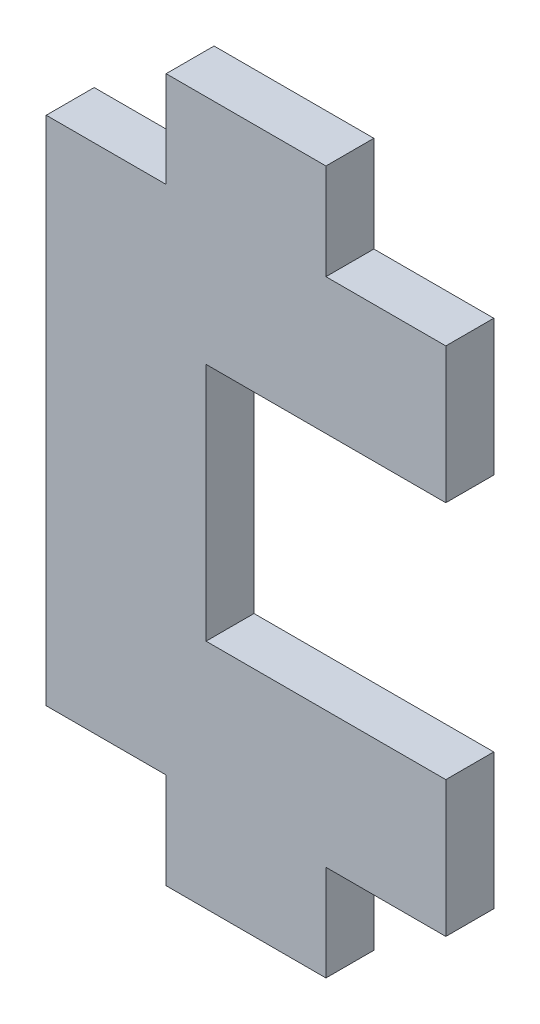
ISO-10303-21;
HEADER;
FILE_DESCRIPTION(('STEP AP214'),'2;1');
FILE_NAME('part.step','',(''),(''),'','','');
FILE_SCHEMA(('AUTOMOTIVE_DESIGN { 1 0 10303 214 1 1 1 1 }'));
ENDSEC;
DATA;
#1=APPLICATION_CONTEXT('core data for automotive mechanical design processes');
#2=APPLICATION_PROTOCOL_DEFINITION('international standard','automotive_design',2000,#1);
#3=PRODUCT_CONTEXT('',#1,'mechanical');
#4=PRODUCT('Part','Part','',(#3));
#5=PRODUCT_RELATED_PRODUCT_CATEGORY('part','',(#4));
#6=PRODUCT_DEFINITION_FORMATION('','',#4);
#7=PRODUCT_DEFINITION_CONTEXT('part definition',#1,'design');
#8=PRODUCT_DEFINITION('design','',#6,#7);
#9=PRODUCT_DEFINITION_SHAPE('','',#8);
#10=(LENGTH_UNIT() NAMED_UNIT(*) SI_UNIT(.MILLI.,.METRE.));
#11=(NAMED_UNIT(*) PLANE_ANGLE_UNIT() SI_UNIT($,.RADIAN.));
#12=(NAMED_UNIT(*) SI_UNIT($,.STERADIAN.) SOLID_ANGLE_UNIT());
#13=UNCERTAINTY_MEASURE_WITH_UNIT(LENGTH_MEASURE(1.E-05),#10,'distance_accuracy_value','');
#14=(GEOMETRIC_REPRESENTATION_CONTEXT(3) GLOBAL_UNCERTAINTY_ASSIGNED_CONTEXT((#13)) GLOBAL_UNIT_ASSIGNED_CONTEXT((#10,
#11,#12)) REPRESENTATION_CONTEXT('',''));
#15=CARTESIAN_POINT('',(0.,0.,0.));
#16=DIRECTION('',(0.,0.,1.));
#17=DIRECTION('',(1.,0.,0.));
#18=AXIS2_PLACEMENT_3D('',#15,#16,#17);
#19=CARTESIAN_POINT('',(0.,-7.5,3.));
#20=DIRECTION('',(0.,1.,0.));
#21=DIRECTION('',(0.,0.,1.));
#22=AXIS2_PLACEMENT_3D('',#19,#20,#21);
#23=PLANE('',#22);
#24=DIRECTION('',(1.,0.,0.));
#25=VECTOR('',#24,1.);
#26=CARTESIAN_POINT('',(0.,-7.5,0.));
#27=LINE('',#26,#25);
#28=CARTESIAN_POINT('',(-2.5,-7.5,0.));
#29=VERTEX_POINT('',#28);
#30=CARTESIAN_POINT('',(12.5,-7.5,0.));
#31=VERTEX_POINT('',#30);
#32=EDGE_CURVE('E231',#29,#31,#27,.T.);
#33=ORIENTED_EDGE('',*,*,#32,.F.);
#34=DIRECTION('',(0.,0.,-1.));
#35=VECTOR('',#34,1.);
#36=CARTESIAN_POINT('',(-2.5,-7.5,3.));
#37=LINE('',#36,#35);
#38=CARTESIAN_POINT('',(-2.5,-7.5,3.));
#39=VERTEX_POINT('',#38);
#40=EDGE_CURVE('E11',#39,#29,#37,.T.);
#41=ORIENTED_EDGE('',*,*,#40,.F.);
#42=DIRECTION('',(1.,0.,0.));
#43=VECTOR('',#42,1.);
#44=CARTESIAN_POINT('',(0.,-7.5,3.));
#45=LINE('',#44,#43);
#46=CARTESIAN_POINT('',(12.5,-7.5,3.));
#47=VERTEX_POINT('',#46);
#48=EDGE_CURVE('E205',#39,#47,#45,.T.);
#49=ORIENTED_EDGE('',*,*,#48,.T.);
#50=DIRECTION('',(0.,0.,-1.));
#51=VECTOR('',#50,1.);
#52=CARTESIAN_POINT('',(12.5,-7.5,3.));
#53=LINE('',#52,#51);
#54=EDGE_CURVE('E112',#47,#31,#53,.T.);
#55=ORIENTED_EDGE('',*,*,#54,.T.);
#56=EDGE_LOOP('',(#33,#41,#49,#55));
#57=FACE_BOUND('',#56,.T.);
#58=ADVANCED_FACE('F37',(#57),#23,.T.);
#59=CARTESIAN_POINT('',(-2.5,0.,3.));
#60=DIRECTION('',(-1.,0.,0.));
#61=DIRECTION('',(0.,0.,1.));
#62=AXIS2_PLACEMENT_3D('',#59,#60,#61);
#63=PLANE('',#62);
#64=DIRECTION('',(0.,1.,0.));
#65=VECTOR('',#64,1.);
#66=CARTESIAN_POINT('',(-2.5,0.,0.));
#67=LINE('',#66,#65);
#68=CARTESIAN_POINT('',(-2.5,7.5,0.));
#69=VERTEX_POINT('',#68);
#70=EDGE_CURVE('E226',#29,#69,#67,.T.);
#71=ORIENTED_EDGE('',*,*,#70,.T.);
#72=DIRECTION('',(0.,0.,-1.));
#73=VECTOR('',#72,1.);
#74=CARTESIAN_POINT('',(-2.5,7.5,3.));
#75=LINE('',#74,#73);
#76=CARTESIAN_POINT('',(-2.5,7.5,3.));
#77=VERTEX_POINT('',#76);
#78=EDGE_CURVE('E45',#77,#69,#75,.T.);
#79=ORIENTED_EDGE('',*,*,#78,.F.);
#80=DIRECTION('',(0.,1.,0.));
#81=VECTOR('',#80,1.);
#82=CARTESIAN_POINT('',(-2.5,0.,3.));
#83=LINE('',#82,#81);
#84=EDGE_CURVE('E203',#39,#77,#83,.T.);
#85=ORIENTED_EDGE('',*,*,#84,.F.);
#86=ORIENTED_EDGE('',*,*,#40,.T.);
#87=EDGE_LOOP('',(#71,#79,#85,#86));
#88=FACE_BOUND('',#87,.T.);
#89=ADVANCED_FACE('F281',(#88),#63,.F.);
#90=CARTESIAN_POINT('',(0.,7.5,3.));
#91=DIRECTION('',(0.,1.,0.));
#92=DIRECTION('',(0.,0.,1.));
#93=AXIS2_PLACEMENT_3D('',#90,#91,#92);
#94=PLANE('',#93);
#95=DIRECTION('',(1.,0.,0.));
#96=VECTOR('',#95,1.);
#97=CARTESIAN_POINT('',(0.,7.5,0.));
#98=LINE('',#97,#96);
#99=CARTESIAN_POINT('',(12.5,7.5,0.));
#100=VERTEX_POINT('',#99);
#101=EDGE_CURVE('E218',#69,#100,#98,.T.);
#102=ORIENTED_EDGE('',*,*,#101,.T.);
#103=DIRECTION('',(0.,0.,-1.));
#104=VECTOR('',#103,1.);
#105=CARTESIAN_POINT('',(12.5,7.5,3.));
#106=LINE('',#105,#104);
#107=CARTESIAN_POINT('',(12.5,7.5,3.));
#108=VERTEX_POINT('',#107);
#109=EDGE_CURVE('E263',#108,#100,#106,.T.);
#110=ORIENTED_EDGE('',*,*,#109,.F.);
#111=DIRECTION('',(1.,0.,0.));
#112=VECTOR('',#111,1.);
#113=CARTESIAN_POINT('',(0.,7.5,3.));
#114=LINE('',#113,#112);
#115=EDGE_CURVE('E201',#77,#108,#114,.T.);
#116=ORIENTED_EDGE('',*,*,#115,.F.);
#117=ORIENTED_EDGE('',*,*,#78,.T.);
#118=EDGE_LOOP('',(#102,#110,#116,#117));
#119=FACE_BOUND('',#118,.T.);
#120=ADVANCED_FACE('F266',(#119),#94,.F.);
#121=CARTESIAN_POINT('',(12.5,0.,3.));
#122=DIRECTION('',(-1.,0.,0.));
#123=DIRECTION('',(0.,0.,1.));
#124=AXIS2_PLACEMENT_3D('',#121,#122,#123);
#125=PLANE('',#124);
#126=DIRECTION('',(0.,1.,0.));
#127=VECTOR('',#126,1.);
#128=CARTESIAN_POINT('',(12.5,0.,0.));
#129=LINE('',#128,#127);
#130=CARTESIAN_POINT('',(12.5,16.,0.));
#131=VERTEX_POINT('',#130);
#132=EDGE_CURVE('E208',#100,#131,#129,.T.);
#133=ORIENTED_EDGE('',*,*,#132,.T.);
#134=DIRECTION('',(0.,0.,-1.));
#135=VECTOR('',#134,1.);
#136=CARTESIAN_POINT('',(12.5,16.,3.));
#137=LINE('',#136,#135);
#138=CARTESIAN_POINT('',(12.5,16.,3.));
#139=VERTEX_POINT('',#138);
#140=EDGE_CURVE('E261',#139,#131,#137,.T.);
#141=ORIENTED_EDGE('',*,*,#140,.F.);
#142=DIRECTION('',(0.,1.,0.));
#143=VECTOR('',#142,1.);
#144=CARTESIAN_POINT('',(12.5,0.,3.));
#145=LINE('',#144,#143);
#146=EDGE_CURVE('E177',#108,#139,#145,.T.);
#147=ORIENTED_EDGE('',*,*,#146,.F.);
#148=ORIENTED_EDGE('',*,*,#109,.T.);
#149=EDGE_LOOP('',(#133,#141,#147,#148));
#150=FACE_BOUND('',#149,.T.);
#151=ADVANCED_FACE('F279',(#150),#125,.F.);
#152=CARTESIAN_POINT('',(0.,16.,3.));
#153=DIRECTION('',(0.,1.,0.));
#154=DIRECTION('',(0.,0.,1.));
#155=AXIS2_PLACEMENT_3D('',#152,#153,#154);
#156=PLANE('',#155);
#157=DIRECTION('',(1.,0.,0.));
#158=VECTOR('',#157,1.);
#159=CARTESIAN_POINT('',(0.,16.,0.));
#160=LINE('',#159,#158);
#161=CARTESIAN_POINT('',(4.99999999999999,16.,0.));
#162=VERTEX_POINT('',#161);
#163=EDGE_CURVE('E217',#162,#131,#160,.T.);
#164=ORIENTED_EDGE('',*,*,#163,.F.);
#165=DIRECTION('',(0.,0.,-1.));
#166=VECTOR('',#165,1.);
#167=CARTESIAN_POINT('',(4.99999999999999,16.,3.));
#168=LINE('',#167,#166);
#169=CARTESIAN_POINT('',(4.99999999999999,16.,3.));
#170=VERTEX_POINT('',#169);
#171=EDGE_CURVE('E259',#170,#162,#168,.T.);
#172=ORIENTED_EDGE('',*,*,#171,.F.);
#173=DIRECTION('',(1.,0.,0.));
#174=VECTOR('',#173,1.);
#175=CARTESIAN_POINT('',(0.,16.,3.));
#176=LINE('',#175,#174);
#177=EDGE_CURVE('E192',#170,#139,#176,.T.);
#178=ORIENTED_EDGE('',*,*,#177,.T.);
#179=ORIENTED_EDGE('',*,*,#140,.T.);
#180=EDGE_LOOP('',(#164,#172,#178,#179));
#181=FACE_BOUND('',#180,.T.);
#182=ADVANCED_FACE('F276',(#181),#156,.T.);
#183=CARTESIAN_POINT('',(5.,0.,3.));
#184=DIRECTION('',(1.,0.,0.));
#185=DIRECTION('',(0.,1.,0.));
#186=AXIS2_PLACEMENT_3D('',#183,#184,#185);
#187=PLANE('',#186);
#188=DIRECTION('',(0.,-1.,0.));
#189=VECTOR('',#188,1.);
#190=CARTESIAN_POINT('',(5.,0.,0.));
#191=LINE('',#190,#189);
#192=CARTESIAN_POINT('',(4.99999999999999,22.,0.));
#193=VERTEX_POINT('',#192);
#194=EDGE_CURVE('E224',#193,#162,#191,.T.);
#195=ORIENTED_EDGE('',*,*,#194,.F.);
#196=DIRECTION('',(0.,0.,-1.));
#197=VECTOR('',#196,1.);
#198=CARTESIAN_POINT('',(4.99999999999999,22.,3.));
#199=LINE('',#198,#197);
#200=CARTESIAN_POINT('',(4.99999999999999,22.,3.));
#201=VERTEX_POINT('',#200);
#202=EDGE_CURVE('E257',#201,#193,#199,.T.);
#203=ORIENTED_EDGE('',*,*,#202,.F.);
#204=DIRECTION('',(0.,-1.,0.));
#205=VECTOR('',#204,1.);
#206=CARTESIAN_POINT('',(5.,0.,3.));
#207=LINE('',#206,#205);
#208=EDGE_CURVE('E197',#201,#170,#207,.T.);
#209=ORIENTED_EDGE('',*,*,#208,.T.);
#210=ORIENTED_EDGE('',*,*,#171,.T.);
#211=EDGE_LOOP('',(#195,#203,#209,#210));
#212=FACE_BOUND('',#211,.T.);
#213=ADVANCED_FACE('F289',(#212),#187,.T.);
#214=CARTESIAN_POINT('',(0.,22.,3.));
#215=DIRECTION('',(0.,-1.,0.));
#216=DIRECTION('',(1.,0.,0.));
#217=AXIS2_PLACEMENT_3D('',#214,#215,#216);
#218=PLANE('',#217);
#219=DIRECTION('',(-1.,0.,0.));
#220=VECTOR('',#219,1.);
#221=CARTESIAN_POINT('',(0.,22.,0.));
#222=LINE('',#221,#220);
#223=CARTESIAN_POINT('',(-5.00000000000001,22.,0.));
#224=VERTEX_POINT('',#223);
#225=EDGE_CURVE('E475',#193,#224,#222,.T.);
#226=ORIENTED_EDGE('',*,*,#225,.T.);
#227=DIRECTION('',(0.,0.,-1.));
#228=VECTOR('',#227,1.);
#229=CARTESIAN_POINT('',(-5.00000000000001,22.,3.));
#230=LINE('',#229,#228);
#231=CARTESIAN_POINT('',(-5.00000000000001,22.,3.));
#232=VERTEX_POINT('',#231);
#233=EDGE_CURVE('E254',#232,#224,#230,.T.);
#234=ORIENTED_EDGE('',*,*,#233,.F.);
#235=DIRECTION('',(-1.,0.,0.));
#236=VECTOR('',#235,1.);
#237=CARTESIAN_POINT('',(0.,22.,3.));
#238=LINE('',#237,#236);
#239=EDGE_CURVE('E195',#201,#232,#238,.T.);
#240=ORIENTED_EDGE('',*,*,#239,.F.);
#241=ORIENTED_EDGE('',*,*,#202,.T.);
#242=EDGE_LOOP('',(#226,#234,#240,#241));
#243=FACE_BOUND('',#242,.T.);
#244=ADVANCED_FACE('F292',(#243),#218,.F.);
#245=CARTESIAN_POINT('',(-4.99999999999999,0.,3.));
#246=DIRECTION('',(1.,0.,0.));
#247=DIRECTION('',(0.,1.,0.));
#248=AXIS2_PLACEMENT_3D('',#245,#246,#247);
#249=PLANE('',#248);
#250=DIRECTION('',(0.,-1.,0.));
#251=VECTOR('',#250,1.);
#252=CARTESIAN_POINT('',(-4.99999999999999,0.,0.));
#253=LINE('',#252,#251);
#254=CARTESIAN_POINT('',(-5.,16.,0.));
#255=VERTEX_POINT('',#254);
#256=EDGE_CURVE('E472',#224,#255,#253,.T.);
#257=ORIENTED_EDGE('',*,*,#256,.T.);
#258=DIRECTION('',(0.,0.,-1.));
#259=VECTOR('',#258,1.);
#260=CARTESIAN_POINT('',(-5.,16.,3.));
#261=LINE('',#260,#259);
#262=CARTESIAN_POINT('',(-5.,16.,3.));
#263=VERTEX_POINT('',#262);
#264=EDGE_CURVE('E252',#263,#255,#261,.T.);
#265=ORIENTED_EDGE('',*,*,#264,.F.);
#266=DIRECTION('',(0.,-1.,0.));
#267=VECTOR('',#266,1.);
#268=CARTESIAN_POINT('',(-4.99999999999999,0.,3.));
#269=LINE('',#268,#267);
#270=EDGE_CURVE('E190',#232,#263,#269,.T.);
#271=ORIENTED_EDGE('',*,*,#270,.F.);
#272=ORIENTED_EDGE('',*,*,#233,.T.);
#273=EDGE_LOOP('',(#257,#265,#271,#272));
#274=FACE_BOUND('',#273,.T.);
#275=ADVANCED_FACE('F296',(#274),#249,.F.);
#276=CARTESIAN_POINT('',(-12.5,16.,0.));
#277=VERTEX_POINT('',#276);
#278=EDGE_CURVE('E225',#277,#255,#160,.T.);
#279=ORIENTED_EDGE('',*,*,#278,.F.);
#280=DIRECTION('',(0.,0.,-1.));
#281=VECTOR('',#280,1.);
#282=CARTESIAN_POINT('',(-12.5,16.,3.));
#283=LINE('',#282,#281);
#284=CARTESIAN_POINT('',(-12.5,16.,3.));
#285=VERTEX_POINT('',#284);
#286=EDGE_CURVE('E250',#285,#277,#283,.T.);
#287=ORIENTED_EDGE('',*,*,#286,.F.);
#288=EDGE_CURVE('E187',#285,#263,#176,.T.);
#289=ORIENTED_EDGE('',*,*,#288,.T.);
#290=ORIENTED_EDGE('',*,*,#264,.T.);
#291=EDGE_LOOP('',(#279,#287,#289,#290));
#292=FACE_BOUND('',#291,.T.);
#293=ADVANCED_FACE('F300',(#292),#156,.T.);
#294=CARTESIAN_POINT('',(-12.5,0.,3.));
#295=DIRECTION('',(-1.,0.,0.));
#296=DIRECTION('',(0.,0.,1.));
#297=AXIS2_PLACEMENT_3D('',#294,#295,#296);
#298=PLANE('',#297);
#299=DIRECTION('',(0.,1.,0.));
#300=VECTOR('',#299,1.);
#301=CARTESIAN_POINT('',(-12.5,0.,0.));
#302=LINE('',#301,#300);
#303=CARTESIAN_POINT('',(-12.5,-16.,0.));
#304=VERTEX_POINT('',#303);
#305=EDGE_CURVE('E465',#304,#277,#302,.T.);
#306=ORIENTED_EDGE('',*,*,#305,.F.);
#307=DIRECTION('',(0.,0.,-1.));
#308=VECTOR('',#307,1.);
#309=CARTESIAN_POINT('',(-12.5,-16.,3.));
#310=LINE('',#309,#308);
#311=CARTESIAN_POINT('',(-12.5,-16.,3.));
#312=VERTEX_POINT('',#311);
#313=EDGE_CURVE('E248',#312,#304,#310,.T.);
#314=ORIENTED_EDGE('',*,*,#313,.F.);
#315=DIRECTION('',(0.,1.,0.));
#316=VECTOR('',#315,1.);
#317=CARTESIAN_POINT('',(-12.5,0.,3.));
#318=LINE('',#317,#316);
#319=EDGE_CURVE('E181',#312,#285,#318,.T.);
#320=ORIENTED_EDGE('',*,*,#319,.T.);
#321=ORIENTED_EDGE('',*,*,#286,.T.);
#322=EDGE_LOOP('',(#306,#314,#320,#321));
#323=FACE_BOUND('',#322,.T.);
#324=ADVANCED_FACE('F304',(#323),#298,.T.);
#325=CARTESIAN_POINT('',(0.,-16.,3.));
#326=DIRECTION('',(0.,1.,0.));
#327=DIRECTION('',(0.,0.,1.));
#328=AXIS2_PLACEMENT_3D('',#325,#326,#327);
#329=PLANE('',#328);
#330=DIRECTION('',(1.,0.,0.));
#331=VECTOR('',#330,1.);
#332=CARTESIAN_POINT('',(0.,-16.,0.));
#333=LINE('',#332,#331);
#334=CARTESIAN_POINT('',(-5.,-16.,0.));
#335=VERTEX_POINT('',#334);
#336=EDGE_CURVE('E213',#304,#335,#333,.T.);
#337=ORIENTED_EDGE('',*,*,#336,.T.);
#338=DIRECTION('',(0.,0.,-1.));
#339=VECTOR('',#338,1.);
#340=CARTESIAN_POINT('',(-5.,-16.,3.));
#341=LINE('',#340,#339);
#342=CARTESIAN_POINT('',(-5.,-16.,3.));
#343=VERTEX_POINT('',#342);
#344=EDGE_CURVE('E243',#343,#335,#341,.T.);
#345=ORIENTED_EDGE('',*,*,#344,.F.);
#346=DIRECTION('',(1.,0.,0.));
#347=VECTOR('',#346,1.);
#348=CARTESIAN_POINT('',(0.,-16.,3.));
#349=LINE('',#348,#347);
#350=EDGE_CURVE('E175',#312,#343,#349,.T.);
#351=ORIENTED_EDGE('',*,*,#350,.F.);
#352=ORIENTED_EDGE('',*,*,#313,.T.);
#353=EDGE_LOOP('',(#337,#345,#351,#352));
#354=FACE_BOUND('',#353,.T.);
#355=ADVANCED_FACE('F308',(#354),#329,.F.);
#356=CARTESIAN_POINT('',(-4.99999999999999,0.,3.));
#357=DIRECTION('',(-1.,0.,0.));
#358=DIRECTION('',(0.,-1.,0.));
#359=AXIS2_PLACEMENT_3D('',#356,#357,#358);
#360=PLANE('',#359);
#361=DIRECTION('',(0.,1.,0.));
#362=VECTOR('',#361,1.);
#363=CARTESIAN_POINT('',(-4.99999999999999,0.,0.));
#364=LINE('',#363,#362);
#365=CARTESIAN_POINT('',(-5.00000000000001,-22.,0.));
#366=VERTEX_POINT('',#365);
#367=EDGE_CURVE('E464',#366,#335,#364,.T.);
#368=ORIENTED_EDGE('',*,*,#367,.F.);
#369=DIRECTION('',(0.,0.,-1.));
#370=VECTOR('',#369,1.);
#371=CARTESIAN_POINT('',(-5.00000000000001,-22.,3.));
#372=LINE('',#371,#370);
#373=CARTESIAN_POINT('',(-5.00000000000001,-22.,3.));
#374=VERTEX_POINT('',#373);
#375=EDGE_CURVE('E238',#374,#366,#372,.T.);
#376=ORIENTED_EDGE('',*,*,#375,.F.);
#377=DIRECTION('',(0.,1.,0.));
#378=VECTOR('',#377,1.);
#379=CARTESIAN_POINT('',(-4.99999999999999,0.,3.));
#380=LINE('',#379,#378);
#381=EDGE_CURVE('E180',#374,#343,#380,.T.);
#382=ORIENTED_EDGE('',*,*,#381,.T.);
#383=ORIENTED_EDGE('',*,*,#344,.T.);
#384=EDGE_LOOP('',(#368,#376,#382,#383));
#385=FACE_BOUND('',#384,.T.);
#386=ADVANCED_FACE('F309',(#385),#360,.T.);
#387=CARTESIAN_POINT('',(0.,-22.,3.));
#388=DIRECTION('',(0.,-1.,0.));
#389=DIRECTION('',(1.,0.,0.));
#390=AXIS2_PLACEMENT_3D('',#387,#388,#389);
#391=PLANE('',#390);
#392=DIRECTION('',(-1.,0.,0.));
#393=VECTOR('',#392,1.);
#394=CARTESIAN_POINT('',(0.,-22.,0.));
#395=LINE('',#394,#393);
#396=CARTESIAN_POINT('',(4.99999999999999,-22.,0.));
#397=VERTEX_POINT('',#396);
#398=EDGE_CURVE('E241',#397,#366,#395,.T.);
#399=ORIENTED_EDGE('',*,*,#398,.F.);
#400=DIRECTION('',(0.,0.,-1.));
#401=VECTOR('',#400,1.);
#402=CARTESIAN_POINT('',(4.99999999999999,-22.,3.));
#403=LINE('',#402,#401);
#404=CARTESIAN_POINT('',(4.99999999999999,-22.,3.));
#405=VERTEX_POINT('',#404);
#406=EDGE_CURVE('E170',#405,#397,#403,.T.);
#407=ORIENTED_EDGE('',*,*,#406,.F.);
#408=DIRECTION('',(-1.,0.,0.));
#409=VECTOR('',#408,1.);
#410=CARTESIAN_POINT('',(0.,-22.,3.));
#411=LINE('',#410,#409);
#412=EDGE_CURVE('E163',#405,#374,#411,.T.);
#413=ORIENTED_EDGE('',*,*,#412,.T.);
#414=ORIENTED_EDGE('',*,*,#375,.T.);
#415=EDGE_LOOP('',(#399,#407,#413,#414));
#416=FACE_BOUND('',#415,.T.);
#417=ADVANCED_FACE('F237',(#416),#391,.T.);
#418=CARTESIAN_POINT('',(5.,0.,3.));
#419=DIRECTION('',(-1.,0.,0.));
#420=DIRECTION('',(0.,-1.,0.));
#421=AXIS2_PLACEMENT_3D('',#418,#419,#420);
#422=PLANE('',#421);
#423=DIRECTION('',(0.,1.,0.));
#424=VECTOR('',#423,1.);
#425=CARTESIAN_POINT('',(5.,0.,0.));
#426=LINE('',#425,#424);
#427=CARTESIAN_POINT('',(5.,-16.,0.));
#428=VERTEX_POINT('',#427);
#429=EDGE_CURVE('E169',#397,#428,#426,.T.);
#430=ORIENTED_EDGE('',*,*,#429,.T.);
#431=DIRECTION('',(0.,0.,-1.));
#432=VECTOR('',#431,1.);
#433=CARTESIAN_POINT('',(5.,-16.,3.));
#434=LINE('',#433,#432);
#435=CARTESIAN_POINT('',(5.,-16.,3.));
#436=VERTEX_POINT('',#435);
#437=EDGE_CURVE('E166',#436,#428,#434,.T.);
#438=ORIENTED_EDGE('',*,*,#437,.F.);
#439=DIRECTION('',(0.,1.,0.));
#440=VECTOR('',#439,1.);
#441=CARTESIAN_POINT('',(5.,0.,3.));
#442=LINE('',#441,#440);
#443=EDGE_CURVE('E156',#405,#436,#442,.T.);
#444=ORIENTED_EDGE('',*,*,#443,.F.);
#445=ORIENTED_EDGE('',*,*,#406,.T.);
#446=EDGE_LOOP('',(#430,#438,#444,#445));
#447=FACE_BOUND('',#446,.T.);
#448=ADVANCED_FACE('F167',(#447),#422,.F.);
#449=CARTESIAN_POINT('',(12.5,-16.,0.));
#450=VERTEX_POINT('',#449);
#451=EDGE_CURVE('E105',#428,#450,#333,.T.);
#452=ORIENTED_EDGE('',*,*,#451,.T.);
#453=DIRECTION('',(0.,0.,-1.));
#454=VECTOR('',#453,1.);
#455=CARTESIAN_POINT('',(12.5,-16.,3.));
#456=LINE('',#455,#454);
#457=CARTESIAN_POINT('',(12.5,-16.,3.));
#458=VERTEX_POINT('',#457);
#459=EDGE_CURVE('E171',#458,#450,#456,.T.);
#460=ORIENTED_EDGE('',*,*,#459,.F.);
#461=EDGE_CURVE('E160',#436,#458,#349,.T.);
#462=ORIENTED_EDGE('',*,*,#461,.F.);
#463=ORIENTED_EDGE('',*,*,#437,.T.);
#464=EDGE_LOOP('',(#452,#460,#462,#463));
#465=FACE_BOUND('',#464,.T.);
#466=ADVANCED_FACE('F173',(#465),#329,.F.);
#467=EDGE_CURVE('E206',#450,#31,#129,.T.);
#468=ORIENTED_EDGE('',*,*,#467,.T.);
#469=ORIENTED_EDGE('',*,*,#54,.F.);
#470=EDGE_CURVE('E53',#458,#47,#145,.T.);
#471=ORIENTED_EDGE('',*,*,#470,.F.);
#472=ORIENTED_EDGE('',*,*,#459,.T.);
#473=EDGE_LOOP('',(#468,#469,#471,#472));
#474=FACE_BOUND('',#473,.T.);
#475=ADVANCED_FACE('F319',(#474),#125,.F.);
#476=CARTESIAN_POINT('',(0.,0.,3.));
#477=DIRECTION('',(0.,0.,1.));
#478=DIRECTION('',(1.,0.,0.));
#479=AXIS2_PLACEMENT_3D('',#476,#477,#478);
#480=PLANE('',#479);
#481=ORIENTED_EDGE('',*,*,#48,.F.);
#482=ORIENTED_EDGE('',*,*,#84,.T.);
#483=ORIENTED_EDGE('',*,*,#115,.T.);
#484=ORIENTED_EDGE('',*,*,#146,.T.);
#485=ORIENTED_EDGE('',*,*,#177,.F.);
#486=ORIENTED_EDGE('',*,*,#208,.F.);
#487=ORIENTED_EDGE('',*,*,#239,.T.);
#488=ORIENTED_EDGE('',*,*,#270,.T.);
#489=ORIENTED_EDGE('',*,*,#288,.F.);
#490=ORIENTED_EDGE('',*,*,#319,.F.);
#491=ORIENTED_EDGE('',*,*,#350,.T.);
#492=ORIENTED_EDGE('',*,*,#381,.F.);
#493=ORIENTED_EDGE('',*,*,#412,.F.);
#494=ORIENTED_EDGE('',*,*,#443,.T.);
#495=ORIENTED_EDGE('',*,*,#461,.T.);
#496=ORIENTED_EDGE('',*,*,#470,.T.);
#497=EDGE_LOOP('',(#481,#482,#483,#484,#485,#486,#487,#488,#489,#490,#491,#492,#493,#494,#495,#496));
#498=FACE_BOUND('',#497,.T.);
#499=ADVANCED_FACE('F158',(#498),#480,.T.);
#500=CARTESIAN_POINT('',(0.,0.,0.));
#501=DIRECTION('',(0.,0.,1.));
#502=DIRECTION('',(1.,0.,0.));
#503=AXIS2_PLACEMENT_3D('',#500,#501,#502);
#504=PLANE('',#503);
#505=ORIENTED_EDGE('',*,*,#32,.T.);
#506=ORIENTED_EDGE('',*,*,#467,.F.);
#507=ORIENTED_EDGE('',*,*,#451,.F.);
#508=ORIENTED_EDGE('',*,*,#429,.F.);
#509=ORIENTED_EDGE('',*,*,#398,.T.);
#510=ORIENTED_EDGE('',*,*,#367,.T.);
#511=ORIENTED_EDGE('',*,*,#336,.F.);
#512=ORIENTED_EDGE('',*,*,#305,.T.);
#513=ORIENTED_EDGE('',*,*,#278,.T.);
#514=ORIENTED_EDGE('',*,*,#256,.F.);
#515=ORIENTED_EDGE('',*,*,#225,.F.);
#516=ORIENTED_EDGE('',*,*,#194,.T.);
#517=ORIENTED_EDGE('',*,*,#163,.T.);
#518=ORIENTED_EDGE('',*,*,#132,.F.);
#519=ORIENTED_EDGE('',*,*,#101,.F.);
#520=ORIENTED_EDGE('',*,*,#70,.F.);
#521=EDGE_LOOP('',(#505,#506,#507,#508,#509,#510,#511,#512,#513,#514,#515,#516,#517,#518,#519,#520));
#522=FACE_BOUND('',#521,.T.);
#523=ADVANCED_FACE('F270',(#522),#504,.F.);
#524=CLOSED_SHELL('',(#58,#89,#120,#151,#182,#213,#244,#275,#293,#324,#355,#386,#417,#448,#466,
#475,#499,#523));
#525=MANIFOLD_SOLID_BREP('B2',#524);
#526=ADVANCED_BREP_SHAPE_REPRESENTATION('',(#18,#525),#14);
#527=SHAPE_DEFINITION_REPRESENTATION(#9,#526);
ENDSEC;
END-ISO-10303-21;
